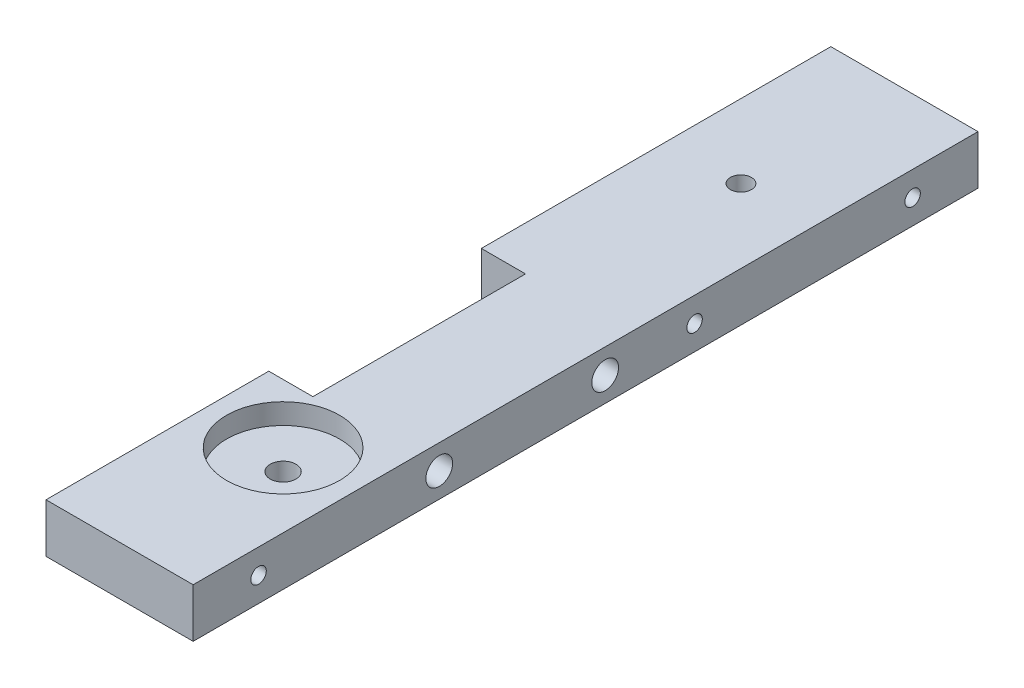
ISO-10303-21;
HEADER;
FILE_DESCRIPTION(('STEP AP214'),'2;1');
FILE_NAME('part.step','',(''),(''),'','','');
FILE_SCHEMA(('AUTOMOTIVE_DESIGN { 1 0 10303 214 1 1 1 1 }'));
ENDSEC;
DATA;
#1=APPLICATION_CONTEXT('core data for automotive mechanical design processes');
#2=APPLICATION_PROTOCOL_DEFINITION('international standard','automotive_design',2000,#1);
#3=PRODUCT_CONTEXT('',#1,'mechanical');
#4=PRODUCT('Part','Part','',(#3));
#5=PRODUCT_RELATED_PRODUCT_CATEGORY('part','',(#4));
#6=PRODUCT_DEFINITION_FORMATION('','',#4);
#7=PRODUCT_DEFINITION_CONTEXT('part definition',#1,'design');
#8=PRODUCT_DEFINITION('design','',#6,#7);
#9=PRODUCT_DEFINITION_SHAPE('','',#8);
#10=(LENGTH_UNIT() NAMED_UNIT(*) SI_UNIT(.MILLI.,.METRE.));
#11=(NAMED_UNIT(*) PLANE_ANGLE_UNIT() SI_UNIT($,.RADIAN.));
#12=(NAMED_UNIT(*) SI_UNIT($,.STERADIAN.) SOLID_ANGLE_UNIT());
#13=UNCERTAINTY_MEASURE_WITH_UNIT(LENGTH_MEASURE(1.E-05),#10,'distance_accuracy_value','');
#14=(GEOMETRIC_REPRESENTATION_CONTEXT(3) GLOBAL_UNCERTAINTY_ASSIGNED_CONTEXT((#13)) GLOBAL_UNIT_ASSIGNED_CONTEXT((#10,
#11,#12)) REPRESENTATION_CONTEXT('',''));
#15=CARTESIAN_POINT('',(0.,0.,0.));
#16=DIRECTION('',(0.,0.,1.));
#17=DIRECTION('',(1.,0.,0.));
#18=AXIS2_PLACEMENT_3D('',#15,#16,#17);
#19=CARTESIAN_POINT('',(0.,9.525,0.));
#20=DIRECTION('',(1.,0.,0.));
#21=DIRECTION('',(0.,0.,-1.));
#22=AXIS2_PLACEMENT_3D('',#19,#20,#21);
#23=PLANE('',#22);
#24=CARTESIAN_POINT('',(0.,4.7625,-139.7));
#25=DIRECTION('',(-1.,0.,0.));
#26=DIRECTION('',(0.,0.,1.));
#27=AXIS2_PLACEMENT_3D('',#24,#25,#26);
#28=CIRCLE('',#27,1.5);
#29=CARTESIAN_POINT('',(0.,4.7625,-138.2));
#30=VERTEX_POINT('',#29);
#31=EDGE_CURVE('E195',#30,#30,#28,.T.);
#32=ORIENTED_EDGE('',*,*,#31,.F.);
#33=EDGE_LOOP('',(#32));
#34=FACE_BOUND('',#33,.T.);
#35=CARTESIAN_POINT('',(0.,4.7625,-97.3666666666667));
#36=DIRECTION('',(-1.,0.,0.));
#37=DIRECTION('',(0.,0.,1.));
#38=AXIS2_PLACEMENT_3D('',#35,#36,#37);
#39=CIRCLE('',#38,1.5);
#40=CARTESIAN_POINT('',(0.,4.7625,-95.8666666666667));
#41=VERTEX_POINT('',#40);
#42=EDGE_CURVE('E198',#41,#41,#39,.T.);
#43=ORIENTED_EDGE('',*,*,#42,.F.);
#44=EDGE_LOOP('',(#43));
#45=FACE_BOUND('',#44,.T.);
#46=DIRECTION('',(0.,0.,1.));
#47=VECTOR('',#46,1.);
#48=CARTESIAN_POINT('',(0.,0.,0.));
#49=LINE('',#48,#47);
#50=CARTESIAN_POINT('',(0.,0.,-152.4));
#51=VERTEX_POINT('',#50);
#52=CARTESIAN_POINT('',(0.,0.,-84.535));
#53=VERTEX_POINT('',#52);
#54=EDGE_CURVE('E133',#51,#53,#49,.T.);
#55=ORIENTED_EDGE('',*,*,#54,.T.);
#56=DIRECTION('',(0.,-1.,0.));
#57=VECTOR('',#56,1.);
#58=CARTESIAN_POINT('',(0.,9.525,-84.535));
#59=LINE('',#58,#57);
#60=CARTESIAN_POINT('',(0.,9.525,-84.535));
#61=VERTEX_POINT('',#60);
#62=EDGE_CURVE('E117',#61,#53,#59,.T.);
#63=ORIENTED_EDGE('',*,*,#62,.F.);
#64=DIRECTION('',(0.,0.,1.));
#65=VECTOR('',#64,1.);
#66=CARTESIAN_POINT('',(0.,9.525,0.));
#67=LINE('',#66,#65);
#68=CARTESIAN_POINT('',(0.,9.525,-152.4));
#69=VERTEX_POINT('',#68);
#70=EDGE_CURVE('E151',#69,#61,#67,.T.);
#71=ORIENTED_EDGE('',*,*,#70,.F.);
#72=DIRECTION('',(0.,-1.,0.));
#73=VECTOR('',#72,1.);
#74=CARTESIAN_POINT('',(0.,9.525,-152.4));
#75=LINE('',#74,#73);
#76=EDGE_CURVE('E141',#69,#51,#75,.T.);
#77=ORIENTED_EDGE('',*,*,#76,.T.);
#78=EDGE_LOOP('',(#55,#63,#71,#77));
#79=FACE_BOUND('',#78,.T.);
#80=ADVANCED_FACE('F42',(#34,#45,#79),#23,.F.);
#81=CARTESIAN_POINT('',(28.575,4.7625,-47.79));
#82=DIRECTION('',(-1.,0.,0.));
#83=DIRECTION('',(0.,0.,1.));
#84=AXIS2_PLACEMENT_3D('',#81,#82,#83);
#85=CYLINDRICAL_SURFACE('',#84,2.6);
#86=CARTESIAN_POINT('',(28.575,4.7625,-47.79));
#87=DIRECTION('',(-1.,0.,0.));
#88=DIRECTION('',(0.,0.,1.));
#89=AXIS2_PLACEMENT_3D('',#86,#87,#88);
#90=CIRCLE('',#89,2.6);
#91=CARTESIAN_POINT('',(28.575,4.7625,-45.19));
#92=VERTEX_POINT('',#91);
#93=EDGE_CURVE('E236',#92,#92,#90,.T.);
#94=ORIENTED_EDGE('',*,*,#93,.F.);
#95=EDGE_LOOP('',(#94));
#96=FACE_BOUND('',#95,.T.);
#97=CARTESIAN_POINT('',(8.57500000000001,4.7625,-47.79));
#98=DIRECTION('',(-1.,0.,0.));
#99=DIRECTION('',(0.,0.,1.));
#100=AXIS2_PLACEMENT_3D('',#97,#98,#99);
#101=CIRCLE('',#100,2.6);
#102=CARTESIAN_POINT('',(8.57500000000001,4.7625,-45.19));
#103=VERTEX_POINT('',#102);
#104=EDGE_CURVE('E233',#103,#103,#101,.F.);
#105=ORIENTED_EDGE('',*,*,#104,.F.);
#106=EDGE_LOOP('',(#105));
#107=FACE_BOUND('',#106,.T.);
#108=ADVANCED_FACE('F184',(#96,#107),#85,.F.);
#109=CARTESIAN_POINT('',(28.575,4.7625,-80.));
#110=DIRECTION('',(-1.,0.,0.));
#111=DIRECTION('',(0.,0.,1.));
#112=AXIS2_PLACEMENT_3D('',#109,#110,#111);
#113=CYLINDRICAL_SURFACE('',#112,2.6);
#114=CARTESIAN_POINT('',(28.575,4.7625,-80.));
#115=DIRECTION('',(-1.,0.,0.));
#116=DIRECTION('',(0.,0.,1.));
#117=AXIS2_PLACEMENT_3D('',#114,#115,#116);
#118=CIRCLE('',#117,2.6);
#119=CARTESIAN_POINT('',(28.575,4.7625,-77.4));
#120=VERTEX_POINT('',#119);
#121=EDGE_CURVE('E237',#120,#120,#118,.T.);
#122=ORIENTED_EDGE('',*,*,#121,.F.);
#123=EDGE_LOOP('',(#122));
#124=FACE_BOUND('',#123,.T.);
#125=CARTESIAN_POINT('',(8.57500000000001,4.7625,-80.));
#126=DIRECTION('',(-1.,0.,0.));
#127=DIRECTION('',(0.,0.,1.));
#128=AXIS2_PLACEMENT_3D('',#125,#126,#127);
#129=CIRCLE('',#128,2.6);
#130=CARTESIAN_POINT('',(8.57500000000001,4.7625,-77.4));
#131=VERTEX_POINT('',#130);
#132=EDGE_CURVE('E46',#131,#131,#129,.F.);
#133=ORIENTED_EDGE('',*,*,#132,.F.);
#134=EDGE_LOOP('',(#133));
#135=FACE_BOUND('',#134,.T.);
#136=ADVANCED_FACE('F166',(#124,#135),#113,.F.);
#137=CARTESIAN_POINT('',(0.,4.7625,-12.7));
#138=DIRECTION('',(-1.,0.,0.));
#139=DIRECTION('',(0.,0.,1.));
#140=AXIS2_PLACEMENT_3D('',#137,#138,#139);
#141=CYLINDRICAL_SURFACE('',#140,1.5);
#142=CARTESIAN_POINT('',(28.575,4.7625,-12.7));
#143=DIRECTION('',(-1.,0.,0.));
#144=DIRECTION('',(0.,0.,1.));
#145=AXIS2_PLACEMENT_3D('',#142,#143,#144);
#146=CIRCLE('',#145,1.49999999999999);
#147=CARTESIAN_POINT('',(28.575,4.7625,-11.2));
#148=VERTEX_POINT('',#147);
#149=EDGE_CURVE('E51',#148,#148,#146,.T.);
#150=ORIENTED_EDGE('',*,*,#149,.F.);
#151=EDGE_LOOP('',(#150));
#152=FACE_BOUND('',#151,.T.);
#153=CARTESIAN_POINT('',(0.,4.7625,-12.7));
#154=DIRECTION('',(-1.,0.,0.));
#155=DIRECTION('',(0.,0.,1.));
#156=AXIS2_PLACEMENT_3D('',#153,#154,#155);
#157=CIRCLE('',#156,1.5);
#158=CARTESIAN_POINT('',(0.,4.7625,-11.2));
#159=VERTEX_POINT('',#158);
#160=EDGE_CURVE('E13',#159,#159,#157,.T.);
#161=ORIENTED_EDGE('',*,*,#160,.T.);
#162=EDGE_LOOP('',(#161));
#163=FACE_BOUND('',#162,.T.);
#164=ADVANCED_FACE('F44',(#152,#163),#141,.F.);
#165=CARTESIAN_POINT('',(28.575,9.525,0.));
#166=DIRECTION('',(0.,0.,-1.));
#167=DIRECTION('',(-1.,0.,0.));
#168=AXIS2_PLACEMENT_3D('',#165,#166,#167);
#169=PLANE('',#168);
#170=DIRECTION('',(1.,0.,0.));
#171=VECTOR('',#170,1.);
#172=CARTESIAN_POINT('',(28.575,0.,0.));
#173=LINE('',#172,#171);
#174=CARTESIAN_POINT('',(0.,0.,0.));
#175=VERTEX_POINT('',#174);
#176=CARTESIAN_POINT('',(28.575,0.,0.));
#177=VERTEX_POINT('',#176);
#178=EDGE_CURVE('E210',#175,#177,#173,.T.);
#179=ORIENTED_EDGE('',*,*,#178,.T.);
#180=DIRECTION('',(0.,-1.,0.));
#181=VECTOR('',#180,1.);
#182=CARTESIAN_POINT('',(28.575,9.525,0.));
#183=LINE('',#182,#181);
#184=CARTESIAN_POINT('',(28.575,9.525,0.));
#185=VERTEX_POINT('',#184);
#186=EDGE_CURVE('E156',#185,#177,#183,.T.);
#187=ORIENTED_EDGE('',*,*,#186,.F.);
#188=DIRECTION('',(1.,0.,0.));
#189=VECTOR('',#188,1.);
#190=CARTESIAN_POINT('',(28.575,9.525,0.));
#191=LINE('',#190,#189);
#192=CARTESIAN_POINT('',(0.,9.525,0.));
#193=VERTEX_POINT('',#192);
#194=EDGE_CURVE('E142',#193,#185,#191,.T.);
#195=ORIENTED_EDGE('',*,*,#194,.F.);
#196=DIRECTION('',(0.,-1.,0.));
#197=VECTOR('',#196,1.);
#198=CARTESIAN_POINT('',(0.,9.525,0.));
#199=LINE('',#198,#197);
#200=EDGE_CURVE('E149',#193,#175,#199,.T.);
#201=ORIENTED_EDGE('',*,*,#200,.T.);
#202=EDGE_LOOP('',(#179,#187,#195,#201));
#203=FACE_BOUND('',#202,.T.);
#204=ADVANCED_FACE('F165',(#203),#169,.F.);
#205=CARTESIAN_POINT('',(28.575,9.525,-152.4));
#206=DIRECTION('',(-1.,0.,0.));
#207=DIRECTION('',(0.,0.,1.));
#208=AXIS2_PLACEMENT_3D('',#205,#206,#207);
#209=PLANE('',#208);
#210=ORIENTED_EDGE('',*,*,#121,.T.);
#211=EDGE_LOOP('',(#210));
#212=FACE_BOUND('',#211,.T.);
#213=ORIENTED_EDGE('',*,*,#93,.T.);
#214=EDGE_LOOP('',(#213));
#215=FACE_BOUND('',#214,.T.);
#216=CARTESIAN_POINT('',(28.575,4.7625,-97.3666666666667));
#217=DIRECTION('',(-1.,0.,0.));
#218=DIRECTION('',(0.,0.,1.));
#219=AXIS2_PLACEMENT_3D('',#216,#217,#218);
#220=CIRCLE('',#219,1.49999999999999);
#221=CARTESIAN_POINT('',(28.575,4.7625,-95.8666666666667));
#222=VERTEX_POINT('',#221);
#223=EDGE_CURVE('E200',#222,#222,#220,.T.);
#224=ORIENTED_EDGE('',*,*,#223,.T.);
#225=EDGE_LOOP('',(#224));
#226=FACE_BOUND('',#225,.T.);
#227=CARTESIAN_POINT('',(28.575,4.7625,-139.7));
#228=DIRECTION('',(-1.,0.,0.));
#229=DIRECTION('',(0.,0.,1.));
#230=AXIS2_PLACEMENT_3D('',#227,#228,#229);
#231=CIRCLE('',#230,1.49999999999999);
#232=CARTESIAN_POINT('',(28.575,4.7625,-138.2));
#233=VERTEX_POINT('',#232);
#234=EDGE_CURVE('E202',#233,#233,#231,.T.);
#235=ORIENTED_EDGE('',*,*,#234,.T.);
#236=EDGE_LOOP('',(#235));
#237=FACE_BOUND('',#236,.T.);
#238=DIRECTION('',(0.,0.,-1.));
#239=VECTOR('',#238,1.);
#240=CARTESIAN_POINT('',(28.575,0.,-152.4));
#241=LINE('',#240,#239);
#242=CARTESIAN_POINT('',(28.575,0.,-152.4));
#243=VERTEX_POINT('',#242);
#244=EDGE_CURVE('E217',#177,#243,#241,.T.);
#245=ORIENTED_EDGE('',*,*,#244,.T.);
#246=DIRECTION('',(0.,-1.,0.));
#247=VECTOR('',#246,1.);
#248=CARTESIAN_POINT('',(28.575,9.525,-152.4));
#249=LINE('',#248,#247);
#250=CARTESIAN_POINT('',(28.575,9.525,-152.4));
#251=VERTEX_POINT('',#250);
#252=EDGE_CURVE('E153',#251,#243,#249,.T.);
#253=ORIENTED_EDGE('',*,*,#252,.F.);
#254=DIRECTION('',(0.,0.,-1.));
#255=VECTOR('',#254,1.);
#256=CARTESIAN_POINT('',(28.575,9.525,-152.4));
#257=LINE('',#256,#255);
#258=EDGE_CURVE('E97',#185,#251,#257,.T.);
#259=ORIENTED_EDGE('',*,*,#258,.F.);
#260=ORIENTED_EDGE('',*,*,#186,.T.);
#261=EDGE_LOOP('',(#245,#253,#259,#260));
#262=FACE_BOUND('',#261,.T.);
#263=ORIENTED_EDGE('',*,*,#149,.T.);
#264=EDGE_LOOP('',(#263));
#265=FACE_BOUND('',#264,.T.);
#266=ADVANCED_FACE('F161',(#212,#215,#226,#237,#262,#265),#209,.F.);
#267=CARTESIAN_POINT('',(0.,9.525,-152.4));
#268=DIRECTION('',(0.,0.,1.));
#269=DIRECTION('',(1.,0.,0.));
#270=AXIS2_PLACEMENT_3D('',#267,#268,#269);
#271=PLANE('',#270);
#272=DIRECTION('',(-1.,0.,0.));
#273=VECTOR('',#272,1.);
#274=CARTESIAN_POINT('',(0.,0.,-152.4));
#275=LINE('',#274,#273);
#276=EDGE_CURVE('E145',#243,#51,#275,.T.);
#277=ORIENTED_EDGE('',*,*,#276,.T.);
#278=ORIENTED_EDGE('',*,*,#76,.F.);
#279=DIRECTION('',(-1.,0.,0.));
#280=VECTOR('',#279,1.);
#281=CARTESIAN_POINT('',(0.,9.525,-152.4));
#282=LINE('',#281,#280);
#283=EDGE_CURVE('E213',#251,#69,#282,.T.);
#284=ORIENTED_EDGE('',*,*,#283,.F.);
#285=ORIENTED_EDGE('',*,*,#252,.T.);
#286=EDGE_LOOP('',(#277,#278,#284,#285));
#287=FACE_BOUND('',#286,.T.);
#288=ADVANCED_FACE('F172',(#287),#271,.F.);
#289=CARTESIAN_POINT('',(0.,9.525,-43.255));
#290=VERTEX_POINT('',#289);
#291=EDGE_CURVE('E67',#290,#193,#67,.T.);
#292=ORIENTED_EDGE('',*,*,#291,.F.);
#293=DIRECTION('',(0.,1.,0.));
#294=VECTOR('',#293,1.);
#295=CARTESIAN_POINT('',(0.,9.525,-43.255));
#296=LINE('',#295,#294);
#297=CARTESIAN_POINT('',(0.,0.,-43.255));
#298=VERTEX_POINT('',#297);
#299=EDGE_CURVE('E125',#298,#290,#296,.T.);
#300=ORIENTED_EDGE('',*,*,#299,.F.);
#301=EDGE_CURVE('E89',#298,#175,#49,.T.);
#302=ORIENTED_EDGE('',*,*,#301,.T.);
#303=ORIENTED_EDGE('',*,*,#200,.F.);
#304=EDGE_LOOP('',(#292,#300,#302,#303));
#305=FACE_BOUND('',#304,.T.);
#306=ORIENTED_EDGE('',*,*,#160,.F.);
#307=EDGE_LOOP('',(#306));
#308=FACE_BOUND('',#307,.T.);
#309=ADVANCED_FACE('F169',(#305,#308),#23,.F.);
#310=CARTESIAN_POINT('',(0.,9.525,0.));
#311=DIRECTION('',(0.,-1.,0.));
#312=DIRECTION('',(0.,0.,-1.));
#313=AXIS2_PLACEMENT_3D('',#310,#311,#312);
#314=PLANE('',#313);
#315=ORIENTED_EDGE('',*,*,#70,.T.);
#316=DIRECTION('',(-1.,0.,0.));
#317=VECTOR('',#316,1.);
#318=CARTESIAN_POINT('',(70.9396553744982,9.525,-84.535));
#319=LINE('',#318,#317);
#320=CARTESIAN_POINT('',(8.57500000000001,9.525,-84.535));
#321=VERTEX_POINT('',#320);
#322=EDGE_CURVE('E120',#321,#61,#319,.T.);
#323=ORIENTED_EDGE('',*,*,#322,.F.);
#324=DIRECTION('',(0.,0.,1.));
#325=VECTOR('',#324,1.);
#326=CARTESIAN_POINT('',(8.57500000000001,9.525,-84.535));
#327=LINE('',#326,#325);
#328=CARTESIAN_POINT('',(8.57500000000001,9.525,-43.255));
#329=VERTEX_POINT('',#328);
#330=EDGE_CURVE('E437',#321,#329,#327,.T.);
#331=ORIENTED_EDGE('',*,*,#330,.T.);
#332=DIRECTION('',(-1.,0.,0.));
#333=VECTOR('',#332,1.);
#334=CARTESIAN_POINT('',(70.9396553744982,9.525,-43.255));
#335=LINE('',#334,#333);
#336=EDGE_CURVE('E226',#329,#290,#335,.T.);
#337=ORIENTED_EDGE('',*,*,#336,.T.);
#338=ORIENTED_EDGE('',*,*,#291,.T.);
#339=ORIENTED_EDGE('',*,*,#194,.T.);
#340=ORIENTED_EDGE('',*,*,#258,.T.);
#341=ORIENTED_EDGE('',*,*,#283,.T.);
#342=EDGE_LOOP('',(#315,#323,#331,#337,#338,#339,#340,#341));
#343=FACE_BOUND('',#342,.T.);
#344=CARTESIAN_POINT('',(14.2875,9.525,-31.75));
#345=DIRECTION('',(0.,1.,0.));
#346=DIRECTION('',(0.,0.,1.));
#347=AXIS2_PLACEMENT_3D('',#344,#345,#346);
#348=CIRCLE('',#347,10.975);
#349=CARTESIAN_POINT('',(14.2875,9.525,-20.775));
#350=VERTEX_POINT('',#349);
#351=EDGE_CURVE('E246',#350,#350,#348,.T.);
#352=ORIENTED_EDGE('',*,*,#351,.F.);
#353=EDGE_LOOP('',(#352));
#354=FACE_BOUND('',#353,.T.);
#355=CARTESIAN_POINT('',(14.2875,9.525,-120.65));
#356=DIRECTION('',(0.,1.,0.));
#357=DIRECTION('',(0.,0.,1.));
#358=AXIS2_PLACEMENT_3D('',#355,#356,#357);
#359=CIRCLE('',#358,2.05);
#360=CARTESIAN_POINT('',(14.2875,9.525,-118.6));
#361=VERTEX_POINT('',#360);
#362=EDGE_CURVE('E252',#361,#361,#359,.T.);
#363=ORIENTED_EDGE('',*,*,#362,.F.);
#364=EDGE_LOOP('',(#363));
#365=FACE_BOUND('',#364,.T.);
#366=ADVANCED_FACE('F171',(#343,#354,#365),#314,.F.);
#367=CARTESIAN_POINT('',(0.,0.,0.));
#368=DIRECTION('',(0.,-1.,0.));
#369=DIRECTION('',(0.,0.,-1.));
#370=AXIS2_PLACEMENT_3D('',#367,#368,#369);
#371=PLANE('',#370);
#372=DIRECTION('',(-1.,0.,0.));
#373=VECTOR('',#372,1.);
#374=CARTESIAN_POINT('',(70.9396553744982,0.,-84.535));
#375=LINE('',#374,#373);
#376=CARTESIAN_POINT('',(8.57500000000001,0.,-84.535));
#377=VERTEX_POINT('',#376);
#378=EDGE_CURVE('E58',#377,#53,#375,.T.);
#379=ORIENTED_EDGE('',*,*,#378,.T.);
#380=ORIENTED_EDGE('',*,*,#54,.F.);
#381=ORIENTED_EDGE('',*,*,#276,.F.);
#382=ORIENTED_EDGE('',*,*,#244,.F.);
#383=ORIENTED_EDGE('',*,*,#178,.F.);
#384=ORIENTED_EDGE('',*,*,#301,.F.);
#385=DIRECTION('',(-1.,0.,0.));
#386=VECTOR('',#385,1.);
#387=CARTESIAN_POINT('',(70.9396553744982,0.,-43.255));
#388=LINE('',#387,#386);
#389=CARTESIAN_POINT('',(8.57500000000001,0.,-43.255));
#390=VERTEX_POINT('',#389);
#391=EDGE_CURVE('E137',#390,#298,#388,.T.);
#392=ORIENTED_EDGE('',*,*,#391,.F.);
#393=DIRECTION('',(0.,0.,-1.));
#394=VECTOR('',#393,1.);
#395=CARTESIAN_POINT('',(8.57500000000001,0.,-84.535));
#396=LINE('',#395,#394);
#397=EDGE_CURVE('E136',#390,#377,#396,.T.);
#398=ORIENTED_EDGE('',*,*,#397,.T.);
#399=EDGE_LOOP('',(#379,#380,#381,#382,#383,#384,#392,#398));
#400=FACE_BOUND('',#399,.T.);
#401=CARTESIAN_POINT('',(14.2875,0.,-31.75));
#402=DIRECTION('',(0.,1.,0.));
#403=DIRECTION('',(0.,0.,1.));
#404=AXIS2_PLACEMENT_3D('',#401,#402,#403);
#405=CIRCLE('',#404,2.5);
#406=CARTESIAN_POINT('',(14.2875,0.,-29.25));
#407=VERTEX_POINT('',#406);
#408=EDGE_CURVE('E243',#407,#407,#405,.T.);
#409=ORIENTED_EDGE('',*,*,#408,.T.);
#410=EDGE_LOOP('',(#409));
#411=FACE_BOUND('',#410,.T.);
#412=CARTESIAN_POINT('',(14.2875,0.,-120.65));
#413=DIRECTION('',(0.,1.,0.));
#414=DIRECTION('',(0.,0.,1.));
#415=AXIS2_PLACEMENT_3D('',#412,#413,#414);
#416=CIRCLE('',#415,2.05);
#417=CARTESIAN_POINT('',(14.2875,0.,-118.6));
#418=VERTEX_POINT('',#417);
#419=EDGE_CURVE('E205',#418,#418,#416,.T.);
#420=ORIENTED_EDGE('',*,*,#419,.T.);
#421=EDGE_LOOP('',(#420));
#422=FACE_BOUND('',#421,.T.);
#423=ADVANCED_FACE('F130',(#400,#411,#422),#371,.T.);
#424=CARTESIAN_POINT('',(0.,4.7625,-139.7));
#425=DIRECTION('',(-1.,0.,0.));
#426=DIRECTION('',(0.,0.,1.));
#427=AXIS2_PLACEMENT_3D('',#424,#425,#426);
#428=CYLINDRICAL_SURFACE('',#427,1.5);
#429=ORIENTED_EDGE('',*,*,#234,.F.);
#430=EDGE_LOOP('',(#429));
#431=FACE_BOUND('',#430,.T.);
#432=ORIENTED_EDGE('',*,*,#31,.T.);
#433=EDGE_LOOP('',(#432));
#434=FACE_BOUND('',#433,.T.);
#435=ADVANCED_FACE('F273',(#431,#434),#428,.F.);
#436=CARTESIAN_POINT('',(0.,4.7625,-97.3666666666667));
#437=DIRECTION('',(-1.,0.,0.));
#438=DIRECTION('',(0.,0.,1.));
#439=AXIS2_PLACEMENT_3D('',#436,#437,#438);
#440=CYLINDRICAL_SURFACE('',#439,1.5);
#441=ORIENTED_EDGE('',*,*,#223,.F.);
#442=EDGE_LOOP('',(#441));
#443=FACE_BOUND('',#442,.T.);
#444=ORIENTED_EDGE('',*,*,#42,.T.);
#445=EDGE_LOOP('',(#444));
#446=FACE_BOUND('',#445,.T.);
#447=ADVANCED_FACE('F263',(#443,#446),#440,.F.);
#448=CARTESIAN_POINT('',(14.2875,0.,-120.65));
#449=DIRECTION('',(0.,1.,0.));
#450=DIRECTION('',(0.,0.,1.));
#451=AXIS2_PLACEMENT_3D('',#448,#449,#450);
#452=CYLINDRICAL_SURFACE('',#451,2.05);
#453=CARTESIAN_POINT('',(14.2875,0.,-118.6));
#454=CARTESIAN_POINT('',(14.2875,0.0992187499999999,-118.6));
#455=CARTESIAN_POINT('',(14.2875,0.1984375,-118.6));
#456=CARTESIAN_POINT('',(14.2875,0.396875,-118.6));
#457=CARTESIAN_POINT('',(14.2875,0.49609375,-118.6));
#458=CARTESIAN_POINT('',(14.2875,0.69453125,-118.6));
#459=CARTESIAN_POINT('',(14.2875,0.79375,-118.6));
#460=CARTESIAN_POINT('',(14.2875,0.9921875,-118.6));
#461=CARTESIAN_POINT('',(14.2875,1.09140625,-118.6));
#462=CARTESIAN_POINT('',(14.2875,1.28984375,-118.6));
#463=CARTESIAN_POINT('',(14.2875,1.3890625,-118.6));
#464=CARTESIAN_POINT('',(14.2875,1.5875,-118.6));
#465=CARTESIAN_POINT('',(14.2875,1.68671875,-118.6));
#466=CARTESIAN_POINT('',(14.2875,1.88515625,-118.6));
#467=CARTESIAN_POINT('',(14.2875,1.984375,-118.6));
#468=CARTESIAN_POINT('',(14.2875,2.1828125,-118.6));
#469=CARTESIAN_POINT('',(14.2875,2.28203125,-118.6));
#470=CARTESIAN_POINT('',(14.2875,2.48046875,-118.6));
#471=CARTESIAN_POINT('',(14.2875,2.5796875,-118.6));
#472=CARTESIAN_POINT('',(14.2875,2.778125,-118.6));
#473=CARTESIAN_POINT('',(14.2875,2.87734375,-118.6));
#474=CARTESIAN_POINT('',(14.2875,3.07578125,-118.6));
#475=CARTESIAN_POINT('',(14.2875,3.175,-118.6));
#476=CARTESIAN_POINT('',(14.2875,3.3734375,-118.6));
#477=CARTESIAN_POINT('',(14.2875,3.47265625,-118.6));
#478=CARTESIAN_POINT('',(14.2875,3.67109375,-118.6));
#479=CARTESIAN_POINT('',(14.2875,3.7703125,-118.6));
#480=CARTESIAN_POINT('',(14.2875,3.96875,-118.6));
#481=CARTESIAN_POINT('',(14.2875,4.06796875,-118.6));
#482=CARTESIAN_POINT('',(14.2875,4.26640625,-118.6));
#483=CARTESIAN_POINT('',(14.2875,4.365625,-118.6));
#484=CARTESIAN_POINT('',(14.2875,4.5640625,-118.6));
#485=CARTESIAN_POINT('',(14.2875,4.66328125,-118.6));
#486=CARTESIAN_POINT('',(14.2875,4.86171875,-118.6));
#487=CARTESIAN_POINT('',(14.2875,4.9609375,-118.6));
#488=CARTESIAN_POINT('',(14.2875,5.159375,-118.6));
#489=CARTESIAN_POINT('',(14.2875,5.25859375,-118.6));
#490=CARTESIAN_POINT('',(14.2875,5.45703125,-118.6));
#491=CARTESIAN_POINT('',(14.2875,5.55625,-118.6));
#492=CARTESIAN_POINT('',(14.2875,5.7546875,-118.6));
#493=CARTESIAN_POINT('',(14.2875,5.85390625,-118.6));
#494=CARTESIAN_POINT('',(14.2875,6.05234375,-118.6));
#495=CARTESIAN_POINT('',(14.2875,6.1515625,-118.6));
#496=CARTESIAN_POINT('',(14.2875,6.35,-118.6));
#497=CARTESIAN_POINT('',(14.2875,6.44921875,-118.6));
#498=CARTESIAN_POINT('',(14.2875,6.64765625,-118.6));
#499=CARTESIAN_POINT('',(14.2875,6.746875,-118.6));
#500=CARTESIAN_POINT('',(14.2875,6.9453125,-118.6));
#501=CARTESIAN_POINT('',(14.2875,7.04453125,-118.6));
#502=CARTESIAN_POINT('',(14.2875,7.24296875,-118.6));
#503=CARTESIAN_POINT('',(14.2875,7.3421875,-118.6));
#504=CARTESIAN_POINT('',(14.2875,7.540625,-118.6));
#505=CARTESIAN_POINT('',(14.2875,7.63984375,-118.6));
#506=CARTESIAN_POINT('',(14.2875,7.83828125,-118.6));
#507=CARTESIAN_POINT('',(14.2875,7.9375,-118.6));
#508=CARTESIAN_POINT('',(14.2875,8.1359375,-118.6));
#509=CARTESIAN_POINT('',(14.2875,8.23515625,-118.6));
#510=CARTESIAN_POINT('',(14.2875,8.43359375,-118.6));
#511=CARTESIAN_POINT('',(14.2875,8.5328125,-118.6));
#512=CARTESIAN_POINT('',(14.2875,8.73125,-118.6));
#513=CARTESIAN_POINT('',(14.2875,8.83046875,-118.6));
#514=CARTESIAN_POINT('',(14.2875,9.02890625,-118.6));
#515=CARTESIAN_POINT('',(14.2875,9.128125,-118.6));
#516=CARTESIAN_POINT('',(14.2875,9.3265625,-118.6));
#517=CARTESIAN_POINT('',(14.2875,9.42578125,-118.6));
#518=CARTESIAN_POINT('',(14.2875,9.525,-118.6));
#519=B_SPLINE_CURVE_WITH_KNOTS('',3,(#453,#454,#455,#456,#457,#458,#459,#460,#461,#462,#463,
#464,#465,#466,#467,#468,#469,#470,#471,#472,#473,#474,#475,#476,#477,#478,#479,#480,#481,#482,
#483,#484,#485,#486,#487,#488,#489,#490,#491,#492,#493,#494,#495,#496,#497,#498,#499,#500,#501,
#502,#503,#504,#505,#506,#507,#508,#509,#510,#511,#512,#513,#514,#515,#516,#517,#518),
.UNSPECIFIED.,.F.,.F.,(4,2,2,2,2,2,2,2,2,2,2,2,2,2,2,2,2,2,2,2,2,2,2,2,2,2,2,2,2,2,2,2,4),(0.,
0.29765625,0.5953125,0.89296875,1.190625,1.48828125,1.7859375,2.08359375,2.38125,2.67890625,
2.9765625,3.27421875,3.571875,3.86953125,4.1671875,4.46484375,4.7625,5.06015625,5.3578125,
5.65546875,5.953125,6.25078125,6.5484375,6.84609375,7.14375,7.44140625,7.7390625,8.03671875,
8.334375,8.63203125,8.9296875,9.22734375,9.525),.UNSPECIFIED.);
#520=EDGE_CURVE('BSEAM259',#418,#361,#519,.T.);
#521=ORIENTED_EDGE('',*,*,#419,.F.);
#522=ORIENTED_EDGE('',*,*,#362,.T.);
#523=ORIENTED_EDGE('',*,*,#520,.T.);
#524=ORIENTED_EDGE('',*,*,#520,.F.);
#525=EDGE_LOOP('',(#521,#523,#522,#524));
#526=FACE_BOUND('',#525,.T.);
#527=ADVANCED_FACE('F259',(#526),#452,.F.);
#528=CARTESIAN_POINT('',(14.2875,5.525,-31.75));
#529=DIRECTION('',(0.,1.,0.));
#530=DIRECTION('',(0.,0.,1.));
#531=AXIS2_PLACEMENT_3D('',#528,#529,#530);
#532=CYLINDRICAL_SURFACE('',#531,10.975);
#533=CARTESIAN_POINT('',(14.2875,5.525,-31.75));
#534=DIRECTION('',(0.,1.,0.));
#535=DIRECTION('',(0.,0.,1.));
#536=AXIS2_PLACEMENT_3D('',#533,#534,#535);
#537=CIRCLE('',#536,10.975);
#538=CARTESIAN_POINT('',(14.2875,5.525,-20.775));
#539=VERTEX_POINT('',#538);
#540=EDGE_CURVE('E249',#539,#539,#537,.T.);
#541=ORIENTED_EDGE('',*,*,#540,.F.);
#542=EDGE_LOOP('',(#541));
#543=FACE_BOUND('',#542,.T.);
#544=ORIENTED_EDGE('',*,*,#351,.T.);
#545=EDGE_LOOP('',(#544));
#546=FACE_BOUND('',#545,.T.);
#547=ADVANCED_FACE('F262',(#543,#546),#532,.F.);
#548=CARTESIAN_POINT('',(14.2875,5.525,-31.75));
#549=DIRECTION('',(0.,1.,0.));
#550=DIRECTION('',(0.,0.,1.));
#551=AXIS2_PLACEMENT_3D('',#548,#549,#550);
#552=PLANE('',#551);
#553=CARTESIAN_POINT('',(14.2875,5.525,-31.75));
#554=DIRECTION('',(0.,1.,0.));
#555=DIRECTION('',(0.,0.,1.));
#556=AXIS2_PLACEMENT_3D('',#553,#554,#555);
#557=CIRCLE('',#556,2.5);
#558=CARTESIAN_POINT('',(14.2875,5.525,-29.25));
#559=VERTEX_POINT('',#558);
#560=EDGE_CURVE('E240',#559,#559,#557,.T.);
#561=ORIENTED_EDGE('',*,*,#560,.F.);
#562=EDGE_LOOP('',(#561));
#563=FACE_BOUND('',#562,.T.);
#564=ORIENTED_EDGE('',*,*,#540,.T.);
#565=EDGE_LOOP('',(#564));
#566=FACE_BOUND('',#565,.T.);
#567=ADVANCED_FACE('F270',(#563,#566),#552,.T.);
#568=CARTESIAN_POINT('',(14.2875,0.,-31.75));
#569=DIRECTION('',(0.,1.,0.));
#570=DIRECTION('',(0.,0.,1.));
#571=AXIS2_PLACEMENT_3D('',#568,#569,#570);
#572=CYLINDRICAL_SURFACE('',#571,2.5);
#573=ORIENTED_EDGE('',*,*,#408,.F.);
#574=EDGE_LOOP('',(#573));
#575=FACE_BOUND('',#574,.T.);
#576=ORIENTED_EDGE('',*,*,#560,.T.);
#577=EDGE_LOOP('',(#576));
#578=FACE_BOUND('',#577,.T.);
#579=ADVANCED_FACE('F295',(#575,#578),#572,.F.);
#580=CARTESIAN_POINT('',(8.575,9.525,-152.4));
#581=DIRECTION('',(-1.,0.,0.));
#582=DIRECTION('',(0.,0.,1.));
#583=AXIS2_PLACEMENT_3D('',#580,#581,#582);
#584=PLANE('',#583);
#585=DIRECTION('',(0.,1.,0.));
#586=VECTOR('',#585,1.);
#587=CARTESIAN_POINT('',(8.57500000000001,9.525,-84.535));
#588=LINE('',#587,#586);
#589=EDGE_CURVE('E232',#377,#321,#588,.T.);
#590=ORIENTED_EDGE('',*,*,#589,.F.);
#591=ORIENTED_EDGE('',*,*,#397,.F.);
#592=DIRECTION('',(0.,-1.,0.));
#593=VECTOR('',#592,1.);
#594=CARTESIAN_POINT('',(8.57500000000001,9.525,-43.255));
#595=LINE('',#594,#593);
#596=EDGE_CURVE('E434',#329,#390,#595,.T.);
#597=ORIENTED_EDGE('',*,*,#596,.F.);
#598=ORIENTED_EDGE('',*,*,#330,.F.);
#599=EDGE_LOOP('',(#590,#591,#597,#598));
#600=FACE_BOUND('',#599,.T.);
#601=ORIENTED_EDGE('',*,*,#132,.T.);
#602=EDGE_LOOP('',(#601));
#603=FACE_BOUND('',#602,.T.);
#604=ORIENTED_EDGE('',*,*,#104,.T.);
#605=EDGE_LOOP('',(#604));
#606=FACE_BOUND('',#605,.T.);
#607=ADVANCED_FACE('F291',(#600,#603,#606),#584,.T.);
#608=CARTESIAN_POINT('',(70.9396553744982,9.525,-84.535));
#609=DIRECTION('',(0.,0.,-1.));
#610=DIRECTION('',(-1.,0.,0.));
#611=AXIS2_PLACEMENT_3D('',#608,#609,#610);
#612=PLANE('',#611);
#613=ORIENTED_EDGE('',*,*,#589,.T.);
#614=ORIENTED_EDGE('',*,*,#322,.T.);
#615=ORIENTED_EDGE('',*,*,#62,.T.);
#616=ORIENTED_EDGE('',*,*,#378,.F.);
#617=EDGE_LOOP('',(#613,#614,#615,#616));
#618=FACE_BOUND('',#617,.T.);
#619=ADVANCED_FACE('F118',(#618),#612,.F.);
#620=CARTESIAN_POINT('',(70.9396553744982,9.525,-43.255));
#621=DIRECTION('',(0.,0.,1.));
#622=DIRECTION('',(0.,-1.,0.));
#623=AXIS2_PLACEMENT_3D('',#620,#621,#622);
#624=PLANE('',#623);
#625=ORIENTED_EDGE('',*,*,#596,.T.);
#626=ORIENTED_EDGE('',*,*,#391,.T.);
#627=ORIENTED_EDGE('',*,*,#299,.T.);
#628=ORIENTED_EDGE('',*,*,#336,.F.);
#629=EDGE_LOOP('',(#625,#626,#627,#628));
#630=FACE_BOUND('',#629,.T.);
#631=ADVANCED_FACE('F305',(#630),#624,.F.);
#632=CLOSED_SHELL('',(#80,#108,#136,#164,#204,#266,#288,#309,#366,#423,#435,#447,#527,#547,#567,
#579,#607,#619,#631));
#633=MANIFOLD_SOLID_BREP('B2',#632);
#634=ADVANCED_BREP_SHAPE_REPRESENTATION('',(#18,#633),#14);
#635=SHAPE_DEFINITION_REPRESENTATION(#9,#634);
ENDSEC;
END-ISO-10303-21;
